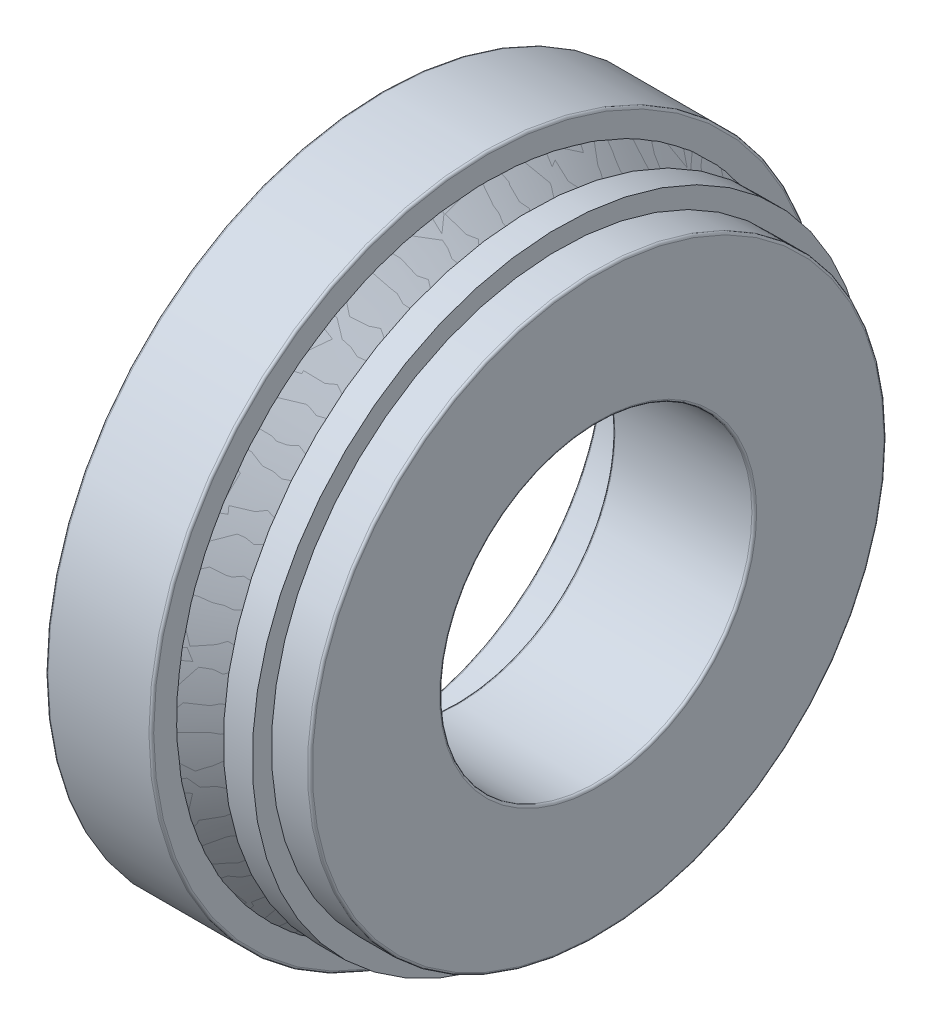
ISO-10303-21;
HEADER;
FILE_DESCRIPTION(('STEP AP214'),'2;1');
FILE_NAME('part.step','',(''),(''),'','','');
FILE_SCHEMA(('AUTOMOTIVE_DESIGN { 1 0 10303 214 1 1 1 1 }'));
ENDSEC;
DATA;
#1=APPLICATION_CONTEXT('core data for automotive mechanical design processes');
#2=APPLICATION_PROTOCOL_DEFINITION('international standard','automotive_design',2000,#1);
#3=PRODUCT_CONTEXT('',#1,'mechanical');
#4=PRODUCT('Part','Part','',(#3));
#5=PRODUCT_RELATED_PRODUCT_CATEGORY('part','',(#4));
#6=PRODUCT_DEFINITION_FORMATION('','',#4);
#7=PRODUCT_DEFINITION_CONTEXT('part definition',#1,'design');
#8=PRODUCT_DEFINITION('design','',#6,#7);
#9=PRODUCT_DEFINITION_SHAPE('','',#8);
#10=(LENGTH_UNIT() NAMED_UNIT(*) SI_UNIT(.MILLI.,.METRE.));
#11=(NAMED_UNIT(*) PLANE_ANGLE_UNIT() SI_UNIT($,.RADIAN.));
#12=(NAMED_UNIT(*) SI_UNIT($,.STERADIAN.) SOLID_ANGLE_UNIT());
#13=UNCERTAINTY_MEASURE_WITH_UNIT(LENGTH_MEASURE(1.E-05),#10,'distance_accuracy_value','');
#14=(GEOMETRIC_REPRESENTATION_CONTEXT(3) GLOBAL_UNCERTAINTY_ASSIGNED_CONTEXT((#13)) GLOBAL_UNIT_ASSIGNED_CONTEXT((#10,
#11,#12)) REPRESENTATION_CONTEXT('',''));
#15=CARTESIAN_POINT('',(0.,0.,0.));
#16=DIRECTION('',(0.,0.,1.));
#17=DIRECTION('',(1.,0.,0.));
#18=AXIS2_PLACEMENT_3D('',#15,#16,#17);
#19=CARTESIAN_POINT('',(-14.,0.,0.));
#20=DIRECTION('',(-1.,0.,0.));
#21=DIRECTION('',(0.,0.,1.));
#22=AXIS2_PLACEMENT_3D('',#19,#20,#21);
#23=CONICAL_SURFACE('',#22,55.7400205583411,0.78539816339745);
#24=CARTESIAN_POINT('',(-23.,0.,0.));
#25=DIRECTION('',(1.,0.,0.));
#26=DIRECTION('',(0.,0.,-1.));
#27=AXIS2_PLACEMENT_3D('',#24,#25,#26);
#28=CIRCLE('',#27,64.7400205583411);
#29=CARTESIAN_POINT('',(-23.,0.,-64.7400205583411));
#30=VERTEX_POINT('',#29);
#31=EDGE_CURVE('E112',#30,#30,#28,.T.);
#32=ORIENTED_EDGE('',*,*,#31,.T.);
#33=EDGE_LOOP('',(#32));
#34=FACE_BOUND('',#33,.T.);
#35=CARTESIAN_POINT('',(-14.,0.,0.));
#36=DIRECTION('',(1.,0.,0.));
#37=DIRECTION('',(0.,0.,-1.));
#38=AXIS2_PLACEMENT_3D('',#35,#36,#37);
#39=CIRCLE('',#38,55.7400205583411);
#40=CARTESIAN_POINT('',(-14.,0.,-55.7400205583411));
#41=VERTEX_POINT('',#40);
#42=EDGE_CURVE('E94',#41,#41,#39,.T.);
#43=ORIENTED_EDGE('',*,*,#42,.F.);
#44=EDGE_LOOP('',(#43));
#45=FACE_BOUND('',#44,.T.);
#46=ADVANCED_FACE('F37',(#34,#45),#23,.T.);
#47=CARTESIAN_POINT('',(-14.,64.,0.));
#48=DIRECTION('',(-1.,0.,0.));
#49=DIRECTION('',(0.,0.,1.));
#50=AXIS2_PLACEMENT_3D('',#47,#48,#49);
#51=PLANE('',#50);
#52=ORIENTED_EDGE('',*,*,#42,.T.);
#53=EDGE_LOOP('',(#52));
#54=FACE_BOUND('',#53,.T.);
#55=CARTESIAN_POINT('',(-14.,0.,0.));
#56=DIRECTION('',(1.,0.,0.));
#57=DIRECTION('',(0.,0.,-1.));
#58=AXIS2_PLACEMENT_3D('',#55,#56,#57);
#59=CIRCLE('',#58,64.);
#60=CARTESIAN_POINT('',(-14.,0.,-64.));
#61=VERTEX_POINT('',#60);
#62=EDGE_CURVE('E97',#61,#61,#59,.T.);
#63=ORIENTED_EDGE('',*,*,#62,.F.);
#64=EDGE_LOOP('',(#63));
#65=FACE_BOUND('',#64,.T.);
#66=ADVANCED_FACE('F134',(#54,#65),#51,.T.);
#67=CARTESIAN_POINT('',(0.,0.,0.));
#68=DIRECTION('',(1.,0.,0.));
#69=DIRECTION('',(0.,0.,-1.));
#70=AXIS2_PLACEMENT_3D('',#67,#68,#69);
#71=CYLINDRICAL_SURFACE('',#70,64.);
#72=ORIENTED_EDGE('',*,*,#62,.T.);
#73=EDGE_LOOP('',(#72));
#74=FACE_BOUND('',#73,.T.);
#75=CARTESIAN_POINT('',(-8.,0.,0.));
#76=DIRECTION('',(1.,0.,0.));
#77=DIRECTION('',(0.,0.,-1.));
#78=AXIS2_PLACEMENT_3D('',#75,#76,#77);
#79=CIRCLE('',#78,64.);
#80=CARTESIAN_POINT('',(-8.,0.,-64.));
#81=VERTEX_POINT('',#80);
#82=EDGE_CURVE('E100',#81,#81,#79,.T.);
#83=ORIENTED_EDGE('',*,*,#82,.F.);
#84=EDGE_LOOP('',(#83));
#85=FACE_BOUND('',#84,.T.);
#86=ADVANCED_FACE('F139',(#74,#85),#71,.T.);
#87=CARTESIAN_POINT('',(-8.,60.,0.));
#88=DIRECTION('',(1.,0.,0.));
#89=DIRECTION('',(0.,0.,-1.));
#90=AXIS2_PLACEMENT_3D('',#87,#88,#89);
#91=PLANE('',#90);
#92=ORIENTED_EDGE('',*,*,#82,.T.);
#93=EDGE_LOOP('',(#92));
#94=FACE_BOUND('',#93,.T.);
#95=CARTESIAN_POINT('',(-8.,0.,0.));
#96=DIRECTION('',(1.,0.,0.));
#97=DIRECTION('',(0.,0.,-1.));
#98=AXIS2_PLACEMENT_3D('',#95,#96,#97);
#99=CIRCLE('',#98,60.);
#100=CARTESIAN_POINT('',(-8.,0.,-60.));
#101=VERTEX_POINT('',#100);
#102=EDGE_CURVE('E103',#101,#101,#99,.T.);
#103=ORIENTED_EDGE('',*,*,#102,.F.);
#104=EDGE_LOOP('',(#103));
#105=FACE_BOUND('',#104,.T.);
#106=ADVANCED_FACE('F214',(#94,#105),#91,.T.);
#107=CARTESIAN_POINT('',(0.,0.,0.));
#108=DIRECTION('',(1.,0.,0.));
#109=DIRECTION('',(0.,0.,-1.));
#110=AXIS2_PLACEMENT_3D('',#107,#108,#109);
#111=CYLINDRICAL_SURFACE('',#110,60.);
#112=CARTESIAN_POINT('',(-0.5,0.,0.));
#113=DIRECTION('',(1.,0.,0.));
#114=DIRECTION('',(0.,0.,-1.));
#115=AXIS2_PLACEMENT_3D('',#112,#113,#114);
#116=CIRCLE('',#115,60.);
#117=CARTESIAN_POINT('',(-0.5,0.,-60.));
#118=VERTEX_POINT('',#117);
#119=EDGE_CURVE('E53',#118,#118,#116,.F.);
#120=ORIENTED_EDGE('',*,*,#119,.T.);
#121=EDGE_LOOP('',(#120));
#122=FACE_BOUND('',#121,.T.);
#123=ORIENTED_EDGE('',*,*,#102,.T.);
#124=EDGE_LOOP('',(#123));
#125=FACE_BOUND('',#124,.T.);
#126=ADVANCED_FACE('F210',(#122,#125),#111,.T.);
#127=CARTESIAN_POINT('',(0.,32.5,0.));
#128=DIRECTION('',(1.,0.,0.));
#129=DIRECTION('',(0.,0.,-1.));
#130=AXIS2_PLACEMENT_3D('',#127,#128,#129);
#131=PLANE('',#130);
#132=CARTESIAN_POINT('',(0.,0.,0.));
#133=DIRECTION('',(1.,0.,0.));
#134=DIRECTION('',(0.,0.,-1.));
#135=AXIS2_PLACEMENT_3D('',#132,#133,#134);
#136=CIRCLE('',#135,33.);
#137=CARTESIAN_POINT('',(0.,0.,-33.));
#138=VERTEX_POINT('',#137);
#139=EDGE_CURVE('E58',#138,#138,#136,.F.);
#140=ORIENTED_EDGE('',*,*,#139,.T.);
#141=EDGE_LOOP('',(#140));
#142=FACE_BOUND('',#141,.T.);
#143=CARTESIAN_POINT('',(0.,0.,0.));
#144=DIRECTION('',(1.,0.,0.));
#145=DIRECTION('',(0.,0.,-1.));
#146=AXIS2_PLACEMENT_3D('',#143,#144,#145);
#147=CIRCLE('',#146,59.5);
#148=CARTESIAN_POINT('',(0.,0.,-59.5));
#149=VERTEX_POINT('',#148);
#150=EDGE_CURVE('E61',#149,#149,#147,.T.);
#151=ORIENTED_EDGE('',*,*,#150,.T.);
#152=EDGE_LOOP('',(#151));
#153=FACE_BOUND('',#152,.T.);
#154=ADVANCED_FACE('F206',(#142,#153),#131,.T.);
#155=CARTESIAN_POINT('',(0.,0.,0.));
#156=DIRECTION('',(1.,0.,0.));
#157=DIRECTION('',(0.,0.,-1.));
#158=AXIS2_PLACEMENT_3D('',#155,#156,#157);
#159=CYLINDRICAL_SURFACE('',#158,32.5);
#160=CARTESIAN_POINT('',(-29.,0.,0.));
#161=DIRECTION('',(-1.,0.,0.));
#162=DIRECTION('',(0.,0.,1.));
#163=AXIS2_PLACEMENT_3D('',#160,#161,#162);
#164=CIRCLE('',#163,32.5);
#165=CARTESIAN_POINT('',(-29.,0.,32.5));
#166=VERTEX_POINT('',#165);
#167=EDGE_CURVE('E64',#166,#166,#164,.T.);
#168=ORIENTED_EDGE('',*,*,#167,.T.);
#169=EDGE_LOOP('',(#168));
#170=FACE_BOUND('',#169,.T.);
#171=CARTESIAN_POINT('',(-0.5,0.,0.));
#172=DIRECTION('',(1.,0.,0.));
#173=DIRECTION('',(0.,0.,-1.));
#174=AXIS2_PLACEMENT_3D('',#171,#172,#173);
#175=CIRCLE('',#174,32.5);
#176=CARTESIAN_POINT('',(-0.5,0.,-32.5));
#177=VERTEX_POINT('',#176);
#178=EDGE_CURVE('E67',#177,#177,#175,.T.);
#179=ORIENTED_EDGE('',*,*,#178,.T.);
#180=EDGE_LOOP('',(#179));
#181=FACE_BOUND('',#180,.T.);
#182=ADVANCED_FACE('F202',(#170,#181),#159,.F.);
#183=CARTESIAN_POINT('',(-29.5,32.5,0.));
#184=DIRECTION('',(-1.,0.,0.));
#185=DIRECTION('',(0.,0.,1.));
#186=AXIS2_PLACEMENT_3D('',#183,#184,#185);
#187=PLANE('',#186);
#188=CARTESIAN_POINT('',(-29.5,0.,0.));
#189=DIRECTION('',(-1.,0.,0.));
#190=DIRECTION('',(0.,0.,1.));
#191=AXIS2_PLACEMENT_3D('',#188,#189,#190);
#192=CIRCLE('',#191,33.);
#193=CARTESIAN_POINT('',(-29.5,0.,33.));
#194=VERTEX_POINT('',#193);
#195=EDGE_CURVE('E70',#194,#194,#192,.F.);
#196=ORIENTED_EDGE('',*,*,#195,.T.);
#197=EDGE_LOOP('',(#196));
#198=FACE_BOUND('',#197,.T.);
#199=CARTESIAN_POINT('',(-29.5,0.,0.));
#200=DIRECTION('',(1.,0.,0.));
#201=DIRECTION('',(0.,0.,-1.));
#202=AXIS2_PLACEMENT_3D('',#199,#200,#201);
#203=CIRCLE('',#202,39.25);
#204=CARTESIAN_POINT('',(-29.5,0.,-39.25));
#205=VERTEX_POINT('',#204);
#206=EDGE_CURVE('E106',#205,#205,#203,.T.);
#207=ORIENTED_EDGE('',*,*,#206,.F.);
#208=EDGE_LOOP('',(#207));
#209=FACE_BOUND('',#208,.T.);
#210=ADVANCED_FACE('F198',(#198,#209),#187,.T.);
#211=CARTESIAN_POINT('',(-36.,0.,0.));
#212=DIRECTION('',(-1.,0.,0.));
#213=DIRECTION('',(0.,0.,1.));
#214=AXIS2_PLACEMENT_3D('',#211,#212,#213);
#215=CONICAL_SURFACE('',#214,45.75,0.78539816339745);
#216=ORIENTED_EDGE('',*,*,#206,.T.);
#217=EDGE_LOOP('',(#216));
#218=FACE_BOUND('',#217,.T.);
#219=CARTESIAN_POINT('',(-36.,0.,0.));
#220=DIRECTION('',(1.,0.,0.));
#221=DIRECTION('',(0.,0.,-1.));
#222=AXIS2_PLACEMENT_3D('',#219,#220,#221);
#223=CIRCLE('',#222,45.75);
#224=CARTESIAN_POINT('',(-36.,0.,-45.75));
#225=VERTEX_POINT('',#224);
#226=EDGE_CURVE('E109',#225,#225,#223,.T.);
#227=ORIENTED_EDGE('',*,*,#226,.F.);
#228=EDGE_LOOP('',(#227));
#229=FACE_BOUND('',#228,.T.);
#230=ADVANCED_FACE('F192',(#218,#229),#215,.F.);
#231=CARTESIAN_POINT('',(0.,0.,0.));
#232=DIRECTION('',(1.,0.,0.));
#233=DIRECTION('',(0.,0.,-1.));
#234=AXIS2_PLACEMENT_3D('',#231,#232,#233);
#235=CYLINDRICAL_SURFACE('',#234,45.75);
#236=CARTESIAN_POINT('',(-44.5,0.,0.));
#237=DIRECTION('',(-1.,0.,0.));
#238=DIRECTION('',(0.,0.,1.));
#239=AXIS2_PLACEMENT_3D('',#236,#237,#238);
#240=CIRCLE('',#239,45.75);
#241=CARTESIAN_POINT('',(-44.5,0.,45.75));
#242=VERTEX_POINT('',#241);
#243=EDGE_CURVE('E73',#242,#242,#240,.T.);
#244=ORIENTED_EDGE('',*,*,#243,.T.);
#245=EDGE_LOOP('',(#244));
#246=FACE_BOUND('',#245,.T.);
#247=ORIENTED_EDGE('',*,*,#226,.T.);
#248=EDGE_LOOP('',(#247));
#249=FACE_BOUND('',#248,.T.);
#250=ADVANCED_FACE('F186',(#246,#249),#235,.F.);
#251=CARTESIAN_POINT('',(-45.,45.75,0.));
#252=DIRECTION('',(-1.,0.,0.));
#253=DIRECTION('',(0.,0.,1.));
#254=AXIS2_PLACEMENT_3D('',#251,#252,#253);
#255=PLANE('',#254);
#256=CARTESIAN_POINT('',(-45.,0.,0.));
#257=DIRECTION('',(-1.,0.,0.));
#258=DIRECTION('',(0.,0.,1.));
#259=AXIS2_PLACEMENT_3D('',#256,#257,#258);
#260=CIRCLE('',#259,46.25);
#261=CARTESIAN_POINT('',(-45.,0.,46.25));
#262=VERTEX_POINT('',#261);
#263=EDGE_CURVE('E76',#262,#262,#260,.F.);
#264=ORIENTED_EDGE('',*,*,#263,.T.);
#265=EDGE_LOOP('',(#264));
#266=FACE_BOUND('',#265,.T.);
#267=CARTESIAN_POINT('',(-45.,0.,0.));
#268=DIRECTION('',(-1.,0.,0.));
#269=DIRECTION('',(0.,0.,1.));
#270=AXIS2_PLACEMENT_3D('',#267,#268,#269);
#271=CIRCLE('',#270,69.5);
#272=CARTESIAN_POINT('',(-45.,0.,69.5));
#273=VERTEX_POINT('',#272);
#274=EDGE_CURVE('E79',#273,#273,#271,.T.);
#275=ORIENTED_EDGE('',*,*,#274,.T.);
#276=EDGE_LOOP('',(#275));
#277=FACE_BOUND('',#276,.T.);
#278=ADVANCED_FACE('F131',(#266,#277),#255,.T.);
#279=CARTESIAN_POINT('',(0.,0.,0.));
#280=DIRECTION('',(1.,0.,0.));
#281=DIRECTION('',(0.,0.,-1.));
#282=AXIS2_PLACEMENT_3D('',#279,#280,#281);
#283=CYLINDRICAL_SURFACE('',#282,70.);
#284=CARTESIAN_POINT('',(-23.5,0.,0.));
#285=DIRECTION('',(1.,0.,0.));
#286=DIRECTION('',(0.,0.,-1.));
#287=AXIS2_PLACEMENT_3D('',#284,#285,#286);
#288=CIRCLE('',#287,70.);
#289=CARTESIAN_POINT('',(-23.5,0.,-70.));
#290=VERTEX_POINT('',#289);
#291=EDGE_CURVE('E10',#290,#290,#288,.F.);
#292=ORIENTED_EDGE('',*,*,#291,.T.);
#293=EDGE_LOOP('',(#292));
#294=FACE_BOUND('',#293,.T.);
#295=CARTESIAN_POINT('',(-44.5,0.,0.));
#296=DIRECTION('',(-1.,0.,0.));
#297=DIRECTION('',(0.,0.,1.));
#298=AXIS2_PLACEMENT_3D('',#295,#296,#297);
#299=CIRCLE('',#298,70.);
#300=CARTESIAN_POINT('',(-44.5,0.,70.));
#301=VERTEX_POINT('',#300);
#302=EDGE_CURVE('E45',#301,#301,#299,.F.);
#303=ORIENTED_EDGE('',*,*,#302,.T.);
#304=EDGE_LOOP('',(#303));
#305=FACE_BOUND('',#304,.T.);
#306=ADVANCED_FACE('F121',(#294,#305),#283,.T.);
#307=CARTESIAN_POINT('',(-23.,64.7400205583411,0.));
#308=DIRECTION('',(1.,0.,0.));
#309=DIRECTION('',(0.,0.,-1.));
#310=AXIS2_PLACEMENT_3D('',#307,#308,#309);
#311=PLANE('',#310);
#312=CARTESIAN_POINT('',(-23.,0.,0.));
#313=DIRECTION('',(1.,0.,0.));
#314=DIRECTION('',(0.,0.,-1.));
#315=AXIS2_PLACEMENT_3D('',#312,#313,#314);
#316=CIRCLE('',#315,69.5);
#317=CARTESIAN_POINT('',(-23.,0.,-69.5));
#318=VERTEX_POINT('',#317);
#319=EDGE_CURVE('E49',#318,#318,#316,.T.);
#320=ORIENTED_EDGE('',*,*,#319,.T.);
#321=EDGE_LOOP('',(#320));
#322=FACE_BOUND('',#321,.T.);
#323=ORIENTED_EDGE('',*,*,#31,.F.);
#324=EDGE_LOOP('',(#323));
#325=FACE_BOUND('',#324,.T.);
#326=ADVANCED_FACE('F118',(#322,#325),#311,.T.);
#327=CARTESIAN_POINT('',(-44.5,0.,0.));
#328=DIRECTION('',(-1.,0.,0.));
#329=DIRECTION('',(0.,0.,1.));
#330=AXIS2_PLACEMENT_3D('',#327,#328,#329);
#331=TOROIDAL_SURFACE('',#330,46.25,0.5);
#332=ORIENTED_EDGE('',*,*,#243,.F.);
#333=EDGE_LOOP('',(#332));
#334=FACE_BOUND('',#333,.T.);
#335=ORIENTED_EDGE('',*,*,#263,.F.);
#336=EDGE_LOOP('',(#335));
#337=FACE_BOUND('',#336,.T.);
#338=ADVANCED_FACE('F120',(#334,#337),#331,.T.);
#339=CARTESIAN_POINT('',(-29.,0.,0.));
#340=DIRECTION('',(-1.,0.,0.));
#341=DIRECTION('',(0.,0.,1.));
#342=AXIS2_PLACEMENT_3D('',#339,#340,#341);
#343=TOROIDAL_SURFACE('',#342,33.,0.5);
#344=ORIENTED_EDGE('',*,*,#167,.F.);
#345=EDGE_LOOP('',(#344));
#346=FACE_BOUND('',#345,.T.);
#347=ORIENTED_EDGE('',*,*,#195,.F.);
#348=EDGE_LOOP('',(#347));
#349=FACE_BOUND('',#348,.T.);
#350=ADVANCED_FACE('F128',(#346,#349),#343,.T.);
#351=CARTESIAN_POINT('',(-0.5,0.,0.));
#352=DIRECTION('',(1.,0.,0.));
#353=DIRECTION('',(0.,0.,-1.));
#354=AXIS2_PLACEMENT_3D('',#351,#352,#353);
#355=TOROIDAL_SURFACE('',#354,33.,0.5);
#356=ORIENTED_EDGE('',*,*,#139,.F.);
#357=EDGE_LOOP('',(#356));
#358=FACE_BOUND('',#357,.T.);
#359=ORIENTED_EDGE('',*,*,#178,.F.);
#360=EDGE_LOOP('',(#359));
#361=FACE_BOUND('',#360,.T.);
#362=ADVANCED_FACE('F163',(#358,#361),#355,.T.);
#363=CARTESIAN_POINT('',(-0.5,0.,0.));
#364=DIRECTION('',(1.,0.,0.));
#365=DIRECTION('',(0.,0.,-1.));
#366=AXIS2_PLACEMENT_3D('',#363,#364,#365);
#367=TOROIDAL_SURFACE('',#366,59.5,0.5);
#368=ORIENTED_EDGE('',*,*,#119,.F.);
#369=EDGE_LOOP('',(#368));
#370=FACE_BOUND('',#369,.T.);
#371=ORIENTED_EDGE('',*,*,#150,.F.);
#372=EDGE_LOOP('',(#371));
#373=FACE_BOUND('',#372,.T.);
#374=ADVANCED_FACE('F167',(#370,#373),#367,.T.);
#375=CARTESIAN_POINT('',(-23.5,0.,0.));
#376=DIRECTION('',(1.,0.,0.));
#377=DIRECTION('',(0.,0.,-1.));
#378=AXIS2_PLACEMENT_3D('',#375,#376,#377);
#379=TOROIDAL_SURFACE('',#378,69.5,0.5);
#380=ORIENTED_EDGE('',*,*,#291,.F.);
#381=EDGE_LOOP('',(#380));
#382=FACE_BOUND('',#381,.T.);
#383=ORIENTED_EDGE('',*,*,#319,.F.);
#384=EDGE_LOOP('',(#383));
#385=FACE_BOUND('',#384,.T.);
#386=ADVANCED_FACE('F170',(#382,#385),#379,.T.);
#387=CARTESIAN_POINT('',(-44.5,0.,0.));
#388=DIRECTION('',(-1.,0.,0.));
#389=DIRECTION('',(0.,0.,1.));
#390=AXIS2_PLACEMENT_3D('',#387,#388,#389);
#391=TOROIDAL_SURFACE('',#390,69.5,0.5);
#392=ORIENTED_EDGE('',*,*,#274,.F.);
#393=EDGE_LOOP('',(#392));
#394=FACE_BOUND('',#393,.T.);
#395=ORIENTED_EDGE('',*,*,#302,.F.);
#396=EDGE_LOOP('',(#395));
#397=FACE_BOUND('',#396,.T.);
#398=ADVANCED_FACE('F39',(#394,#397),#391,.T.);
#399=CLOSED_SHELL('',(#46,#66,#86,#106,#126,#154,#182,#210,#230,#250,#278,#306,#326,#338,#350,
#362,#374,#386,#398));
#400=CARTESIAN_POINT('',(42.,0.,0.));
#401=DIRECTION('',(1.,0.,0.));
#402=DIRECTION('',(0.,1.,0.));
#403=AXIS2_PLACEMENT_3D('',#400,#401,#402);
#404=SPHERICAL_SURFACE('',#403,95.);
#405=CARTESIAN_POINT('',(-39.3355432929289,0.,0.));
#406=DIRECTION('',(1.,0.,0.));
#407=DIRECTION('',(0.,0.,-1.));
#408=AXIS2_PLACEMENT_3D('',#405,#406,#407);
#409=CIRCLE('',#408,49.0869575064913);
#410=CARTESIAN_POINT('',(-39.3355432929289,49.0869575064913,0.));
#411=VERTEX_POINT('',#410);
#412=EDGE_CURVE('E82',#411,#411,#409,.T.);
#413=CARTESIAN_POINT('',(-25.305713897495,0.,0.));
#414=DIRECTION('',(1.,0.,0.));
#415=DIRECTION('',(0.,0.,-1.));
#416=AXIS2_PLACEMENT_3D('',#413,#414,#415);
#417=CIRCLE('',#416,67.0443202422737);
#418=CARTESIAN_POINT('',(-25.3057138974949,67.0443202422737,0.));
#419=VERTEX_POINT('',#418);
#420=EDGE_CURVE('E91',#419,#419,#417,.T.);
#421=CARTESIAN_POINT('',(-39.3355432929289,49.0869575064913,0.));
#422=CARTESIAN_POINT('',(-39.2125933308893,49.2906817581135,0.));
#423=CARTESIAN_POINT('',(-39.0888779246522,49.4939440548794,0.));
#424=CARTESIAN_POINT('',(-38.8399232770034,49.8995333035202,0.));
#425=CARTESIAN_POINT('',(-38.7146840355916,50.101860255395,0.));
#426=CARTESIAN_POINT('',(-38.4626887708136,50.5055673790747,0.));
#427=CARTESIAN_POINT('',(-38.3359327474474,50.7069475508797,0.));
#428=CARTESIAN_POINT('',(-38.0809110806775,51.1087497468503,0.));
#429=CARTESIAN_POINT('',(-37.9526454372739,51.3091717710159,0.));
#430=CARTESIAN_POINT('',(-37.6946117714066,51.7090463544468,0.));
#431=CARTESIAN_POINT('',(-37.564843748943,51.908498913712,0.));
#432=CARTESIAN_POINT('',(-37.3038126524176,52.3064233058359,0.));
#433=CARTESIAN_POINT('',(-37.1725495783559,52.5048951386945,0.));
#434=CARTESIAN_POINT('',(-36.9085357900678,52.9008468716017,0.));
#435=CARTESIAN_POINT('',(-36.7757850758416,53.0983267716503,0.));
#436=CARTESIAN_POINT('',(-36.5088035027738,53.4922834886147,0.));
#437=CARTESIAN_POINT('',(-36.3745726439322,53.6887603055304,0.));
#438=CARTESIAN_POINT('',(-36.1046383607251,54.0806997625238,0.));
#439=CARTESIAN_POINT('',(-35.9689349363594,54.2761624026015,0.));
#440=CARTESIAN_POINT('',(-35.6960631843493,54.6660624694826,0.));
#441=CARTESIAN_POINT('',(-35.5588948567048,54.860499896286,0.));
#442=CARTESIAN_POINT('',(-35.2831010430932,55.2483385580675,0.));
#443=CARTESIAN_POINT('',(-35.144475557126,55.4417397930456,0.));
#444=CARTESIAN_POINT('',(-34.8657752541015,55.8274951511328,0.));
#445=CARTESIAN_POINT('',(-34.7257004370441,56.0198492742418,0.));
#446=CARTESIAN_POINT('',(-34.4441093809052,56.40349954767,0.));
#447=CARTESIAN_POINT('',(-34.3025931418237,56.5947956979891,0.));
#448=CARTESIAN_POINT('',(-34.0181272320899,56.9763192246533,0.));
#449=CARTESIAN_POINT('',(-33.8751775614376,57.1665466009983,0.));
#450=CARTESIAN_POINT('',(-33.5878528599519,57.5459218388764,0.));
#451=CARTESIAN_POINT('',(-33.4434778291183,57.7350697004094,0.));
#452=CARTESIAN_POINT('',(-33.1533105591398,58.1122752287784,0.));
#453=CARTESIAN_POINT('',(-33.0075183199948,58.3003328956143,0.));
#454=CARTESIAN_POINT('',(-32.7145248652831,58.6753474162599,0.));
#455=CARTESIAN_POINT('',(-32.5673236497164,58.8623042700695,0.));
#456=CARTESIAN_POINT('',(-32.2715205536065,59.2351066084886,0.));
#457=CARTESIAN_POINT('',(-32.1229186730633,59.420952093098,0.));
#458=CARTESIAN_POINT('',(-31.8243226375313,59.7915211996942,0.));
#459=CARTESIAN_POINT('',(-31.6743284825426,59.976244821681,0.));
#460=CARTESIAN_POINT('',(-31.3729563672629,60.3445597729533,0.));
#461=CARTESIAN_POINT('',(-31.2215784069719,60.5281511022389,0.));
#462=CARTESIAN_POINT('',(-30.917447228365,60.8941911019631,0.));
#463=CARTESIAN_POINT('',(-30.764694010049,61.0766397724018,0.));
#464=CARTESIAN_POINT('',(-30.4578209403209,61.4403841528045,0.));
#465=CARTESIAN_POINT('',(-30.3037010889088,61.6216798627686,0.));
#466=CARTESIAN_POINT('',(-29.9941034550811,61.9831080856943,0.));
#467=CARTESIAN_POINT('',(-29.8386256726657,62.163240598656,0.));
#468=CARTESIAN_POINT('',(-29.5263209555982,62.5223322567271,0.));
#469=CARTESIAN_POINT('',(-29.369494020946,62.7012914018367,0.));
#470=CARTESIAN_POINT('',(-29.0544998543472,63.0580262196041,0.));
#471=CARTESIAN_POINT('',(-28.8963326224005,63.2358018922621,0.));
#472=CARTESIAN_POINT('',(-28.578666791839,63.5901597273564,0.));
#473=CARTESIAN_POINT('',(-28.4191681932243,63.7667418897929,0.));
#474=CARTESIAN_POINT('',(-28.0988486350999,64.1187027340376,0.));
#475=CARTESIAN_POINT('',(-27.9380276755903,64.2940814158459,0.));
#476=CARTESIAN_POINT('',(-27.6150724762134,64.6436253964775,0.));
#477=CARTESIAN_POINT('',(-27.4529382363462,64.8177906953008,0.));
#478=CARTESIAN_POINT('',(-27.127365630572,65.1648980757529,0.));
#479=CARTESIAN_POINT('',(-26.963927264665,65.3378401573816,0.));
#480=CARTESIAN_POINT('',(-26.6357556361503,65.6824913396616,0.));
#481=CARTESIAN_POINT('',(-26.4710223735427,65.8542004403128,0.));
#482=CARTESIAN_POINT('',(-26.1402702489063,66.1963759613964,0.));
#483=CARTESIAN_POINT('',(-25.9742513868775,66.3668423818287,0.));
#484=CARTESIAN_POINT('',(-25.6409374525755,66.7065229323449,0.));
#485=CARTESIAN_POINT('',(-25.4736423803022,66.8757370624288,0.));
#486=CARTESIAN_POINT('',(-25.3057138974949,67.0443202422737,0.));
#487=B_SPLINE_CURVE_WITH_KNOTS('',3,(#421,#422,#423,#424,#425,#426,#427,#428,#429,#430,#431,
#432,#433,#434,#435,#436,#437,#438,#439,#440,#441,#442,#443,#444,#445,#446,#447,#448,#449,#450,
#451,#452,#453,#454,#455,#456,#457,#458,#459,#460,#461,#462,#463,#464,#465,#466,#467,#468,#469,
#470,#471,#472,#473,#474,#475,#476,#477,#478,#479,#480,#481,#482,#483,#484,#485,#486),
.UNSPECIFIED.,.F.,.F.,(4,2,2,2,2,2,2,2,2,2,2,2,2,2,2,2,2,2,2,2,2,2,2,2,2,2,2,2,2,2,2,2,4),(0.,
0.71384870700296,1.42769741400593,2.14154612100887,2.85539482801185,3.5692435350148,
4.28309224201776,4.99694094902073,5.71078965602369,6.42463836302665,7.13848707002962,
7.85233577703258,8.56618448403553,9.2800331910385,9.99388189804146,10.7077306050444,
11.4215793120474,12.1354280190503,12.8492767260533,13.5631254330563,14.2769741400592,
14.9908228470622,15.7046715540651,16.4185202610681,17.1323689680711,17.846217675074,
18.560066382077,19.2739150890799,19.9877637960829,20.7016125030859,21.4154612100888,
22.1293099170918,22.8431586240948),.UNSPECIFIED.);
#488=EDGE_CURVE('BSEAM156',#411,#419,#487,.T.);
#489=ORIENTED_EDGE('',*,*,#412,.F.);
#490=ORIENTED_EDGE('',*,*,#420,.T.);
#491=ORIENTED_EDGE('',*,*,#488,.T.);
#492=ORIENTED_EDGE('',*,*,#488,.F.);
#493=EDGE_LOOP('',(#489,#491,#490,#492));
#494=FACE_BOUND('',#493,.T.);
#495=ADVANCED_FACE('F156',(#494),#404,.F.);
#496=CARTESIAN_POINT('',(-39.3355432929289,0.,0.));
#497=DIRECTION('',(-1.,0.,0.));
#498=DIRECTION('',(0.,0.,1.));
#499=AXIS2_PLACEMENT_3D('',#496,#497,#498);
#500=CONICAL_SURFACE('',#499,49.0869575064913,0.78539816339745);
#501=CARTESIAN_POINT('',(-26.1630424935087,0.,0.));
#502=DIRECTION('',(1.,0.,0.));
#503=DIRECTION('',(0.,0.,-1.));
#504=AXIS2_PLACEMENT_3D('',#501,#502,#503);
#505=CIRCLE('',#504,35.914456707071);
#506=CARTESIAN_POINT('',(-26.1630424935087,0.,-35.914456707071));
#507=VERTEX_POINT('',#506);
#508=EDGE_CURVE('E85',#507,#507,#505,.T.);
#509=ORIENTED_EDGE('',*,*,#508,.F.);
#510=EDGE_LOOP('',(#509));
#511=FACE_BOUND('',#510,.T.);
#512=ORIENTED_EDGE('',*,*,#412,.T.);
#513=EDGE_LOOP('',(#512));
#514=FACE_BOUND('',#513,.T.);
#515=ADVANCED_FACE('F152',(#511,#514),#500,.T.);
#516=CARTESIAN_POINT('',(-75.2499999999997,0.,0.));
#517=DIRECTION('',(1.,0.,0.));
#518=DIRECTION('',(0.,0.,-1.));
#519=AXIS2_PLACEMENT_3D('',#516,#517,#518);
#520=TOROIDAL_SURFACE('',#519,117.25,95.);
#521=CARTESIAN_POINT('',(-8.20567975772622,0.,0.));
#522=DIRECTION('',(1.,0.,0.));
#523=DIRECTION('',(0.,0.,-1.));
#524=AXIS2_PLACEMENT_3D('',#521,#522,#523);
#525=CIRCLE('',#524,49.944286102505);
#526=CARTESIAN_POINT('',(-8.20567975772622,0.,-49.944286102505));
#527=VERTEX_POINT('',#526);
#528=EDGE_CURVE('E88',#527,#527,#525,.T.);
#529=ORIENTED_EDGE('',*,*,#528,.F.);
#530=EDGE_LOOP('',(#529));
#531=FACE_BOUND('',#530,.T.);
#532=ORIENTED_EDGE('',*,*,#508,.T.);
#533=EDGE_LOOP('',(#532));
#534=FACE_BOUND('',#533,.T.);
#535=ADVANCED_FACE('F147',(#531,#534),#520,.F.);
#536=CARTESIAN_POINT('',(-8.20567975772622,0.,0.));
#537=DIRECTION('',(-1.,0.,0.));
#538=DIRECTION('',(0.,0.,1.));
#539=AXIS2_PLACEMENT_3D('',#536,#537,#538);
#540=CONICAL_SURFACE('',#539,49.944286102505,0.785398163397449);
#541=ORIENTED_EDGE('',*,*,#420,.F.);
#542=EDGE_LOOP('',(#541));
#543=FACE_BOUND('',#542,.T.);
#544=ORIENTED_EDGE('',*,*,#528,.T.);
#545=EDGE_LOOP('',(#544));
#546=FACE_BOUND('',#545,.T.);
#547=ADVANCED_FACE('F144',(#543,#546),#540,.F.);
#548=CLOSED_SHELL('',(#495,#515,#535,#547));
#549=ORIENTED_CLOSED_SHELL('',*,#548,.T.);
#550=BREP_WITH_VOIDS('B2',#399,(#549));
#551=ADVANCED_BREP_SHAPE_REPRESENTATION('',(#18,#550),#14);
#552=SHAPE_DEFINITION_REPRESENTATION(#9,#551);
ENDSEC;
END-ISO-10303-21;
